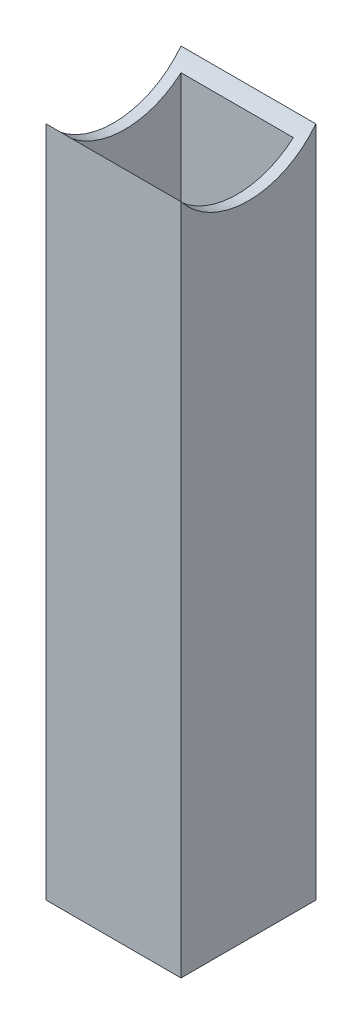
ISO-10303-21;
HEADER;
FILE_DESCRIPTION(('STEP AP214'),'2;1');
FILE_NAME('part.step','',(''),(''),'','','');
FILE_SCHEMA(('AUTOMOTIVE_DESIGN { 1 0 10303 214 1 1 1 1 }'));
ENDSEC;
DATA;
#1=APPLICATION_CONTEXT('core data for automotive mechanical design processes');
#2=APPLICATION_PROTOCOL_DEFINITION('international standard','automotive_design',2000,#1);
#3=PRODUCT_CONTEXT('',#1,'mechanical');
#4=PRODUCT('Part','Part','',(#3));
#5=PRODUCT_RELATED_PRODUCT_CATEGORY('part','',(#4));
#6=PRODUCT_DEFINITION_FORMATION('','',#4);
#7=PRODUCT_DEFINITION_CONTEXT('part definition',#1,'design');
#8=PRODUCT_DEFINITION('design','',#6,#7);
#9=PRODUCT_DEFINITION_SHAPE('','',#8);
#10=(LENGTH_UNIT() NAMED_UNIT(*) SI_UNIT(.MILLI.,.METRE.));
#11=(NAMED_UNIT(*) PLANE_ANGLE_UNIT() SI_UNIT($,.RADIAN.));
#12=(NAMED_UNIT(*) SI_UNIT($,.STERADIAN.) SOLID_ANGLE_UNIT());
#13=UNCERTAINTY_MEASURE_WITH_UNIT(LENGTH_MEASURE(1.E-05),#10,'distance_accuracy_value','');
#14=(GEOMETRIC_REPRESENTATION_CONTEXT(3) GLOBAL_UNCERTAINTY_ASSIGNED_CONTEXT((#13)) GLOBAL_UNIT_ASSIGNED_CONTEXT((#10,
#11,#12)) REPRESENTATION_CONTEXT('',''));
#15=CARTESIAN_POINT('',(0.,0.,0.));
#16=DIRECTION('',(0.,0.,1.));
#17=DIRECTION('',(1.,0.,0.));
#18=AXIS2_PLACEMENT_3D('',#15,#16,#17);
#19=CARTESIAN_POINT('',(38.1,204.76972,-19.05));
#20=DIRECTION('',(-1.,0.,0.));
#21=DIRECTION('',(0.,0.,1.));
#22=AXIS2_PLACEMENT_3D('',#19,#20,#21);
#23=CYLINDRICAL_SURFACE('',#22,24.13);
#24=DIRECTION('',(-1.,0.,0.));
#25=VECTOR('',#24,1.);
#26=CARTESIAN_POINT('',(38.1,186.597178213007,-3.175));
#27=LINE('',#26,#25);
#28=CARTESIAN_POINT('',(3.175,186.597178213007,-3.175));
#29=VERTEX_POINT('',#28);
#30=CARTESIAN_POINT('',(34.925,186.597178213007,-3.175));
#31=VERTEX_POINT('',#30);
#32=EDGE_CURVE('E131',#29,#31,#27,.F.);
#33=ORIENTED_EDGE('',*,*,#32,.F.);
#34=CARTESIAN_POINT('',(3.175,204.76972,-19.05));
#35=DIRECTION('',(-1.,0.,0.));
#36=DIRECTION('',(0.,0.,1.));
#37=AXIS2_PLACEMENT_3D('',#34,#35,#36);
#38=CIRCLE('',#37,24.13);
#39=CARTESIAN_POINT('',(3.175,186.597178213007,-34.925));
#40=VERTEX_POINT('',#39);
#41=EDGE_CURVE('E124',#40,#29,#38,.T.);
#42=ORIENTED_EDGE('',*,*,#41,.F.);
#43=DIRECTION('',(-1.,0.,0.));
#44=VECTOR('',#43,1.);
#45=CARTESIAN_POINT('',(38.1,186.597178213007,-34.925));
#46=LINE('',#45,#44);
#47=CARTESIAN_POINT('',(34.925,186.597178213007,-34.925));
#48=VERTEX_POINT('',#47);
#49=EDGE_CURVE('E104',#48,#40,#46,.T.);
#50=ORIENTED_EDGE('',*,*,#49,.F.);
#51=CARTESIAN_POINT('',(34.925,204.76972,-19.05));
#52=DIRECTION('',(1.,0.,0.));
#53=DIRECTION('',(0.,0.,-1.));
#54=AXIS2_PLACEMENT_3D('',#51,#52,#53);
#55=CIRCLE('',#54,24.13);
#56=EDGE_CURVE('E129',#31,#48,#55,.T.);
#57=ORIENTED_EDGE('',*,*,#56,.F.);
#58=EDGE_LOOP('',(#33,#42,#50,#57));
#59=FACE_BOUND('',#58,.T.);
#60=CARTESIAN_POINT('',(0.,204.76972,-19.05));
#61=DIRECTION('',(1.,0.,0.));
#62=DIRECTION('',(0.,0.,-1.));
#63=AXIS2_PLACEMENT_3D('',#60,#61,#62);
#64=CIRCLE('',#63,24.13);
#65=CARTESIAN_POINT('',(0.,189.959102187093,0.));
#66=VERTEX_POINT('',#65);
#67=CARTESIAN_POINT('',(0.,189.959102187093,-38.1));
#68=VERTEX_POINT('',#67);
#69=EDGE_CURVE('E133',#66,#68,#64,.T.);
#70=ORIENTED_EDGE('',*,*,#69,.F.);
#71=DIRECTION('',(-1.,0.,0.));
#72=VECTOR('',#71,1.);
#73=CARTESIAN_POINT('',(38.1,189.959102187093,0.));
#74=LINE('',#73,#72);
#75=CARTESIAN_POINT('',(38.1,189.959102187093,0.));
#76=VERTEX_POINT('',#75);
#77=EDGE_CURVE('E11',#76,#66,#74,.T.);
#78=ORIENTED_EDGE('',*,*,#77,.F.);
#79=CARTESIAN_POINT('',(38.1,204.76972,-19.05));
#80=DIRECTION('',(1.,0.,0.));
#81=DIRECTION('',(0.,0.,-1.));
#82=AXIS2_PLACEMENT_3D('',#79,#80,#81);
#83=CIRCLE('',#82,24.13);
#84=CARTESIAN_POINT('',(38.1,189.959102187093,-38.1));
#85=VERTEX_POINT('',#84);
#86=EDGE_CURVE('E134',#76,#85,#83,.T.);
#87=ORIENTED_EDGE('',*,*,#86,.T.);
#88=DIRECTION('',(-1.,0.,0.));
#89=VECTOR('',#88,1.);
#90=CARTESIAN_POINT('',(38.1,189.959102187093,-38.1));
#91=LINE('',#90,#89);
#92=EDGE_CURVE('E145',#85,#68,#91,.T.);
#93=ORIENTED_EDGE('',*,*,#92,.T.);
#94=EDGE_LOOP('',(#70,#78,#87,#93));
#95=FACE_BOUND('',#94,.T.);
#96=ADVANCED_FACE('F35',(#59,#95),#23,.F.);
#97=CARTESIAN_POINT('',(38.1,0.,0.));
#98=DIRECTION('',(0.,0.,1.));
#99=DIRECTION('',(1.,0.,0.));
#100=AXIS2_PLACEMENT_3D('',#97,#98,#99);
#101=PLANE('',#100);
#102=DIRECTION('',(0.,1.,0.));
#103=VECTOR('',#102,1.);
#104=CARTESIAN_POINT('',(0.,0.,0.));
#105=LINE('',#104,#103);
#106=CARTESIAN_POINT('',(0.,0.,0.));
#107=VERTEX_POINT('',#106);
#108=EDGE_CURVE('E148',#107,#66,#105,.T.);
#109=ORIENTED_EDGE('',*,*,#108,.F.);
#110=DIRECTION('',(-1.,0.,0.));
#111=VECTOR('',#110,1.);
#112=CARTESIAN_POINT('',(38.1,0.,0.));
#113=LINE('',#112,#111);
#114=CARTESIAN_POINT('',(38.1,0.,0.));
#115=VERTEX_POINT('',#114);
#116=EDGE_CURVE('E42',#115,#107,#113,.T.);
#117=ORIENTED_EDGE('',*,*,#116,.F.);
#118=DIRECTION('',(0.,1.,0.));
#119=VECTOR('',#118,1.);
#120=CARTESIAN_POINT('',(38.1,0.,0.));
#121=LINE('',#120,#119);
#122=EDGE_CURVE('E137',#115,#76,#121,.T.);
#123=ORIENTED_EDGE('',*,*,#122,.T.);
#124=ORIENTED_EDGE('',*,*,#77,.T.);
#125=EDGE_LOOP('',(#109,#117,#123,#124));
#126=FACE_BOUND('',#125,.T.);
#127=ADVANCED_FACE('F167',(#126),#101,.T.);
#128=CARTESIAN_POINT('',(38.1,0.,0.));
#129=DIRECTION('',(0.,1.,0.));
#130=DIRECTION('',(0.,0.,1.));
#131=AXIS2_PLACEMENT_3D('',#128,#129,#130);
#132=PLANE('',#131);
#133=DIRECTION('',(0.,0.,-1.));
#134=VECTOR('',#133,1.);
#135=CARTESIAN_POINT('',(3.175,0.,-3.175));
#136=LINE('',#135,#134);
#137=CARTESIAN_POINT('',(3.175,0.,-3.175));
#138=VERTEX_POINT('',#137);
#139=CARTESIAN_POINT('',(3.175,0.,-34.925));
#140=VERTEX_POINT('',#139);
#141=EDGE_CURVE('E110',#138,#140,#136,.T.);
#142=ORIENTED_EDGE('',*,*,#141,.F.);
#143=DIRECTION('',(-1.,0.,0.));
#144=VECTOR('',#143,1.);
#145=CARTESIAN_POINT('',(34.925,0.,-3.175));
#146=LINE('',#145,#144);
#147=CARTESIAN_POINT('',(34.925,0.,-3.175));
#148=VERTEX_POINT('',#147);
#149=EDGE_CURVE('E57',#148,#138,#146,.T.);
#150=ORIENTED_EDGE('',*,*,#149,.F.);
#151=DIRECTION('',(0.,0.,1.));
#152=VECTOR('',#151,1.);
#153=CARTESIAN_POINT('',(34.925,0.,-34.925));
#154=LINE('',#153,#152);
#155=CARTESIAN_POINT('',(34.925,0.,-34.925));
#156=VERTEX_POINT('',#155);
#157=EDGE_CURVE('E117',#156,#148,#154,.T.);
#158=ORIENTED_EDGE('',*,*,#157,.F.);
#159=DIRECTION('',(1.,0.,0.));
#160=VECTOR('',#159,1.);
#161=CARTESIAN_POINT('',(3.175,0.,-34.925));
#162=LINE('',#161,#160);
#163=EDGE_CURVE('E101',#140,#156,#162,.T.);
#164=ORIENTED_EDGE('',*,*,#163,.F.);
#165=EDGE_LOOP('',(#142,#150,#158,#164));
#166=FACE_BOUND('',#165,.T.);
#167=DIRECTION('',(0.,0.,-1.));
#168=VECTOR('',#167,1.);
#169=CARTESIAN_POINT('',(0.,0.,0.));
#170=LINE('',#169,#168);
#171=CARTESIAN_POINT('',(0.,0.,-38.1));
#172=VERTEX_POINT('',#171);
#173=EDGE_CURVE('E151',#107,#172,#170,.T.);
#174=ORIENTED_EDGE('',*,*,#173,.T.);
#175=DIRECTION('',(-1.,0.,0.));
#176=VECTOR('',#175,1.);
#177=CARTESIAN_POINT('',(38.1,0.,-38.1));
#178=LINE('',#177,#176);
#179=CARTESIAN_POINT('',(38.1,0.,-38.1));
#180=VERTEX_POINT('',#179);
#181=EDGE_CURVE('E156',#180,#172,#178,.T.);
#182=ORIENTED_EDGE('',*,*,#181,.F.);
#183=DIRECTION('',(0.,0.,-1.));
#184=VECTOR('',#183,1.);
#185=CARTESIAN_POINT('',(38.1,0.,0.));
#186=LINE('',#185,#184);
#187=EDGE_CURVE('E141',#115,#180,#186,.T.);
#188=ORIENTED_EDGE('',*,*,#187,.F.);
#189=ORIENTED_EDGE('',*,*,#116,.T.);
#190=EDGE_LOOP('',(#174,#182,#188,#189));
#191=FACE_BOUND('',#190,.T.);
#192=ADVANCED_FACE('F114',(#166,#191),#132,.F.);
#193=CARTESIAN_POINT('',(38.1,0.,-38.1));
#194=DIRECTION('',(0.,0.,1.));
#195=DIRECTION('',(1.,0.,0.));
#196=AXIS2_PLACEMENT_3D('',#193,#194,#195);
#197=PLANE('',#196);
#198=DIRECTION('',(0.,1.,0.));
#199=VECTOR('',#198,1.);
#200=CARTESIAN_POINT('',(0.,0.,-38.1));
#201=LINE('',#200,#199);
#202=EDGE_CURVE('E138',#172,#68,#201,.T.);
#203=ORIENTED_EDGE('',*,*,#202,.T.);
#204=ORIENTED_EDGE('',*,*,#92,.F.);
#205=DIRECTION('',(0.,1.,0.));
#206=VECTOR('',#205,1.);
#207=CARTESIAN_POINT('',(38.1,0.,-38.1));
#208=LINE('',#207,#206);
#209=EDGE_CURVE('E143',#180,#85,#208,.T.);
#210=ORIENTED_EDGE('',*,*,#209,.F.);
#211=ORIENTED_EDGE('',*,*,#181,.T.);
#212=EDGE_LOOP('',(#203,#204,#210,#211));
#213=FACE_BOUND('',#212,.T.);
#214=ADVANCED_FACE('F174',(#213),#197,.F.);
#215=CARTESIAN_POINT('',(38.1,0.,0.));
#216=DIRECTION('',(1.,0.,0.));
#217=DIRECTION('',(0.,0.,-1.));
#218=AXIS2_PLACEMENT_3D('',#215,#216,#217);
#219=PLANE('',#218);
#220=ORIENTED_EDGE('',*,*,#86,.F.);
#221=ORIENTED_EDGE('',*,*,#122,.F.);
#222=ORIENTED_EDGE('',*,*,#187,.T.);
#223=ORIENTED_EDGE('',*,*,#209,.T.);
#224=EDGE_LOOP('',(#220,#221,#222,#223));
#225=FACE_BOUND('',#224,.T.);
#226=ADVANCED_FACE('F176',(#225),#219,.T.);
#227=CARTESIAN_POINT('',(0.,0.,0.));
#228=DIRECTION('',(1.,0.,0.));
#229=DIRECTION('',(0.,0.,-1.));
#230=AXIS2_PLACEMENT_3D('',#227,#228,#229);
#231=PLANE('',#230);
#232=ORIENTED_EDGE('',*,*,#69,.T.);
#233=ORIENTED_EDGE('',*,*,#202,.F.);
#234=ORIENTED_EDGE('',*,*,#173,.F.);
#235=ORIENTED_EDGE('',*,*,#108,.T.);
#236=EDGE_LOOP('',(#232,#233,#234,#235));
#237=FACE_BOUND('',#236,.T.);
#238=ADVANCED_FACE('F166',(#237),#231,.F.);
#239=CARTESIAN_POINT('',(34.925,189.959102187093,-3.175));
#240=DIRECTION('',(0.,0.,1.));
#241=DIRECTION('',(1.,0.,0.));
#242=AXIS2_PLACEMENT_3D('',#239,#240,#241);
#243=PLANE('',#242);
#244=ORIENTED_EDGE('',*,*,#32,.T.);
#245=DIRECTION('',(0.,-1.,0.));
#246=VECTOR('',#245,1.);
#247=CARTESIAN_POINT('',(34.925,189.959102187093,-3.175));
#248=LINE('',#247,#246);
#249=EDGE_CURVE('E122',#31,#148,#248,.T.);
#250=ORIENTED_EDGE('',*,*,#249,.T.);
#251=ORIENTED_EDGE('',*,*,#149,.T.);
#252=DIRECTION('',(0.,-1.,0.));
#253=VECTOR('',#252,1.);
#254=CARTESIAN_POINT('',(3.175,189.959102187093,-3.175));
#255=LINE('',#254,#253);
#256=EDGE_CURVE('E107',#29,#138,#255,.T.);
#257=ORIENTED_EDGE('',*,*,#256,.F.);
#258=EDGE_LOOP('',(#244,#250,#251,#257));
#259=FACE_BOUND('',#258,.T.);
#260=ADVANCED_FACE('F183',(#259),#243,.F.);
#261=CARTESIAN_POINT('',(34.925,189.959102187093,-34.925));
#262=DIRECTION('',(1.,0.,0.));
#263=DIRECTION('',(0.,0.,-1.));
#264=AXIS2_PLACEMENT_3D('',#261,#262,#263);
#265=PLANE('',#264);
#266=ORIENTED_EDGE('',*,*,#56,.T.);
#267=DIRECTION('',(0.,-1.,0.));
#268=VECTOR('',#267,1.);
#269=CARTESIAN_POINT('',(34.925,189.959102187093,-34.925));
#270=LINE('',#269,#268);
#271=EDGE_CURVE('E106',#48,#156,#270,.T.);
#272=ORIENTED_EDGE('',*,*,#271,.T.);
#273=ORIENTED_EDGE('',*,*,#157,.T.);
#274=ORIENTED_EDGE('',*,*,#249,.F.);
#275=EDGE_LOOP('',(#266,#272,#273,#274));
#276=FACE_BOUND('',#275,.T.);
#277=ADVANCED_FACE('F196',(#276),#265,.F.);
#278=CARTESIAN_POINT('',(3.175,189.959102187093,-34.925));
#279=DIRECTION('',(0.,0.,-1.));
#280=DIRECTION('',(-1.,0.,0.));
#281=AXIS2_PLACEMENT_3D('',#278,#279,#280);
#282=PLANE('',#281);
#283=ORIENTED_EDGE('',*,*,#49,.T.);
#284=DIRECTION('',(0.,-1.,0.));
#285=VECTOR('',#284,1.);
#286=CARTESIAN_POINT('',(3.175,189.959102187093,-34.925));
#287=LINE('',#286,#285);
#288=EDGE_CURVE('E49',#40,#140,#287,.T.);
#289=ORIENTED_EDGE('',*,*,#288,.T.);
#290=ORIENTED_EDGE('',*,*,#163,.T.);
#291=ORIENTED_EDGE('',*,*,#271,.F.);
#292=EDGE_LOOP('',(#283,#289,#290,#291));
#293=FACE_BOUND('',#292,.T.);
#294=ADVANCED_FACE('F98',(#293),#282,.F.);
#295=CARTESIAN_POINT('',(3.175,189.959102187093,-3.175));
#296=DIRECTION('',(-1.,0.,0.));
#297=DIRECTION('',(0.,0.,1.));
#298=AXIS2_PLACEMENT_3D('',#295,#296,#297);
#299=PLANE('',#298);
#300=ORIENTED_EDGE('',*,*,#41,.T.);
#301=ORIENTED_EDGE('',*,*,#256,.T.);
#302=ORIENTED_EDGE('',*,*,#141,.T.);
#303=ORIENTED_EDGE('',*,*,#288,.F.);
#304=EDGE_LOOP('',(#300,#301,#302,#303));
#305=FACE_BOUND('',#304,.T.);
#306=ADVANCED_FACE('F111',(#305),#299,.F.);
#307=CLOSED_SHELL('',(#96,#127,#192,#214,#226,#238,#260,#277,#294,#306));
#308=MANIFOLD_SOLID_BREP('B2',#307);
#309=ADVANCED_BREP_SHAPE_REPRESENTATION('',(#18,#308),#14);
#310=SHAPE_DEFINITION_REPRESENTATION(#9,#309);
ENDSEC;
END-ISO-10303-21;
